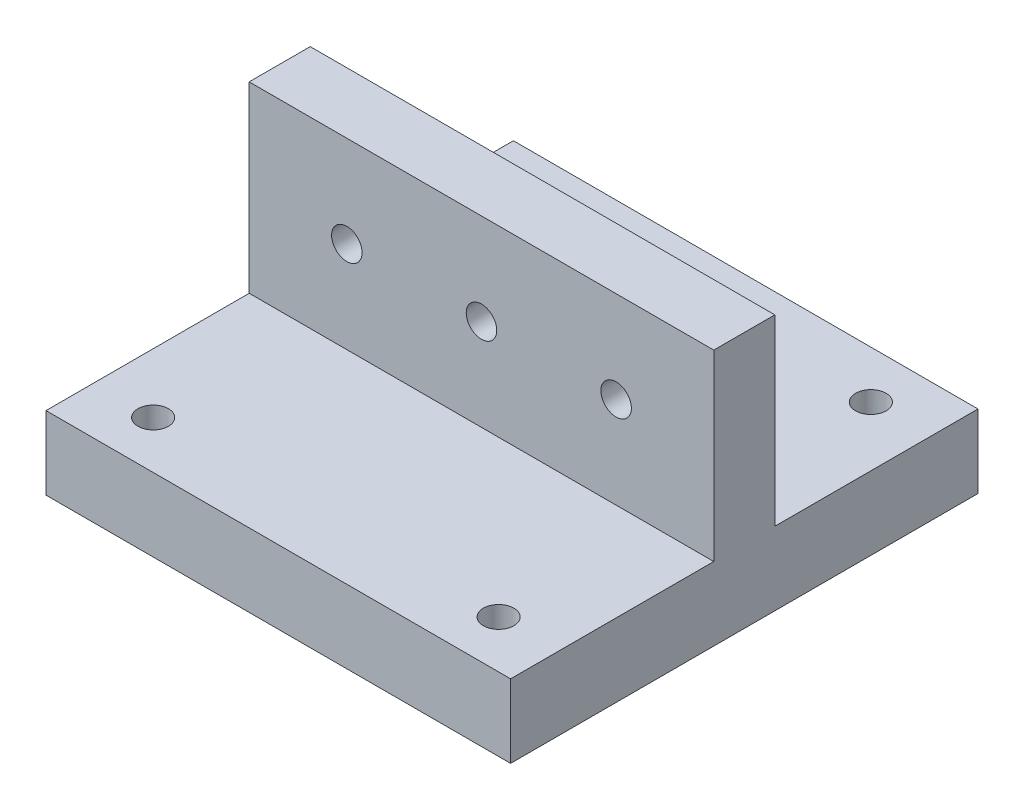
ISO-10303-21;
HEADER;
FILE_DESCRIPTION(('STEP AP214'),'2;1');
FILE_NAME('part.step','',(''),(''),'','','');
FILE_SCHEMA(('AUTOMOTIVE_DESIGN { 1 0 10303 214 1 1 1 1 }'));
ENDSEC;
DATA;
#1=APPLICATION_CONTEXT('core data for automotive mechanical design processes');
#2=APPLICATION_PROTOCOL_DEFINITION('international standard','automotive_design',2000,#1);
#3=PRODUCT_CONTEXT('',#1,'mechanical');
#4=PRODUCT('Part','Part','',(#3));
#5=PRODUCT_RELATED_PRODUCT_CATEGORY('part','',(#4));
#6=PRODUCT_DEFINITION_FORMATION('','',#4);
#7=PRODUCT_DEFINITION_CONTEXT('part definition',#1,'design');
#8=PRODUCT_DEFINITION('design','',#6,#7);
#9=PRODUCT_DEFINITION_SHAPE('','',#8);
#10=(LENGTH_UNIT() NAMED_UNIT(*) SI_UNIT(.MILLI.,.METRE.));
#11=(NAMED_UNIT(*) PLANE_ANGLE_UNIT() SI_UNIT($,.RADIAN.));
#12=(NAMED_UNIT(*) SI_UNIT($,.STERADIAN.) SOLID_ANGLE_UNIT());
#13=UNCERTAINTY_MEASURE_WITH_UNIT(LENGTH_MEASURE(1.E-05),#10,'distance_accuracy_value','');
#14=(GEOMETRIC_REPRESENTATION_CONTEXT(3) GLOBAL_UNCERTAINTY_ASSIGNED_CONTEXT((#13)) GLOBAL_UNIT_ASSIGNED_CONTEXT((#10,
#11,#12)) REPRESENTATION_CONTEXT('',''));
#15=CARTESIAN_POINT('',(0.,0.,0.));
#16=DIRECTION('',(0.,0.,1.));
#17=DIRECTION('',(1.,0.,0.));
#18=AXIS2_PLACEMENT_3D('',#15,#16,#17);
#19=CARTESIAN_POINT('',(0.,21.,0.));
#20=DIRECTION('',(1.,0.,0.));
#21=DIRECTION('',(0.,0.,-1.));
#22=AXIS2_PLACEMENT_3D('',#19,#20,#21);
#23=PLANE('',#22);
#24=DIRECTION('',(0.,0.,1.));
#25=VECTOR('',#24,1.);
#26=CARTESIAN_POINT('',(0.,21.,0.));
#27=LINE('',#26,#25);
#28=CARTESIAN_POINT('',(0.,21.,-21.645000016));
#29=VERTEX_POINT('',#28);
#30=CARTESIAN_POINT('',(0.,21.,-16.645000016));
#31=VERTEX_POINT('',#30);
#32=EDGE_CURVE('E121',#29,#31,#27,.T.);
#33=ORIENTED_EDGE('',*,*,#32,.F.);
#34=DIRECTION('',(0.,1.,0.));
#35=VECTOR('',#34,1.);
#36=CARTESIAN_POINT('',(0.,27.0590059354838,-21.645000016));
#37=LINE('',#36,#35);
#38=CARTESIAN_POINT('',(0.,6.,-21.645000016));
#39=VERTEX_POINT('',#38);
#40=EDGE_CURVE('E39',#39,#29,#37,.T.);
#41=ORIENTED_EDGE('',*,*,#40,.F.);
#42=DIRECTION('',(0.,0.,1.));
#43=VECTOR('',#42,1.);
#44=CARTESIAN_POINT('',(0.,6.,-46.7968028387097));
#45=LINE('',#44,#43);
#46=CARTESIAN_POINT('',(0.,6.,-38.29));
#47=VERTEX_POINT('',#46);
#48=EDGE_CURVE('E86',#47,#39,#45,.T.);
#49=ORIENTED_EDGE('',*,*,#48,.F.);
#50=DIRECTION('',(0.,-1.,0.));
#51=VECTOR('',#50,1.);
#52=CARTESIAN_POINT('',(0.,21.,-38.29));
#53=LINE('',#52,#51);
#54=CARTESIAN_POINT('',(0.,0.,-38.29));
#55=VERTEX_POINT('',#54);
#56=EDGE_CURVE('E127',#47,#55,#53,.T.);
#57=ORIENTED_EDGE('',*,*,#56,.T.);
#58=DIRECTION('',(0.,0.,1.));
#59=VECTOR('',#58,1.);
#60=CARTESIAN_POINT('',(0.,0.,0.));
#61=LINE('',#60,#59);
#62=CARTESIAN_POINT('',(0.,0.,0.));
#63=VERTEX_POINT('',#62);
#64=EDGE_CURVE('E120',#55,#63,#61,.T.);
#65=ORIENTED_EDGE('',*,*,#64,.T.);
#66=DIRECTION('',(0.,-1.,0.));
#67=VECTOR('',#66,1.);
#68=CARTESIAN_POINT('',(0.,21.,0.));
#69=LINE('',#68,#67);
#70=CARTESIAN_POINT('',(0.,6.,0.));
#71=VERTEX_POINT('',#70);
#72=EDGE_CURVE('E141',#71,#63,#69,.T.);
#73=ORIENTED_EDGE('',*,*,#72,.F.);
#74=DIRECTION('',(0.,0.,1.));
#75=VECTOR('',#74,1.);
#76=CARTESIAN_POINT('',(0.,6.,13.6292637419355));
#77=LINE('',#76,#75);
#78=CARTESIAN_POINT('',(0.,6.,-16.645000016));
#79=VERTEX_POINT('',#78);
#80=EDGE_CURVE('E110',#79,#71,#77,.T.);
#81=ORIENTED_EDGE('',*,*,#80,.F.);
#82=DIRECTION('',(0.,-1.,0.));
#83=VECTOR('',#82,1.);
#84=CARTESIAN_POINT('',(0.,27.0590059354838,-16.645000016));
#85=LINE('',#84,#83);
#86=EDGE_CURVE('E113',#31,#79,#85,.T.);
#87=ORIENTED_EDGE('',*,*,#86,.F.);
#88=EDGE_LOOP('',(#33,#41,#49,#57,#65,#73,#81,#87));
#89=FACE_BOUND('',#88,.T.);
#90=ADVANCED_FACE('F17',(#89),#23,.F.);
#91=CARTESIAN_POINT('',(0.,21.,0.));
#92=DIRECTION('',(0.,0.,-1.));
#93=DIRECTION('',(-1.,0.,0.));
#94=AXIS2_PLACEMENT_3D('',#91,#92,#93);
#95=PLANE('',#94);
#96=DIRECTION('',(0.,-1.,0.));
#97=VECTOR('',#96,1.);
#98=CARTESIAN_POINT('',(38.06,21.,0.));
#99=LINE('',#98,#97);
#100=CARTESIAN_POINT('',(38.06,6.,0.));
#101=VERTEX_POINT('',#100);
#102=CARTESIAN_POINT('',(38.06,0.,0.));
#103=VERTEX_POINT('',#102);
#104=EDGE_CURVE('E139',#101,#103,#99,.T.);
#105=ORIENTED_EDGE('',*,*,#104,.F.);
#106=DIRECTION('',(-1.,0.,0.));
#107=VECTOR('',#106,1.);
#108=CARTESIAN_POINT('',(0.,6.,0.));
#109=LINE('',#108,#107);
#110=EDGE_CURVE('E87',#101,#71,#109,.T.);
#111=ORIENTED_EDGE('',*,*,#110,.T.);
#112=ORIENTED_EDGE('',*,*,#72,.T.);
#113=DIRECTION('',(1.,0.,0.));
#114=VECTOR('',#113,1.);
#115=CARTESIAN_POINT('',(0.,0.,0.));
#116=LINE('',#115,#114);
#117=EDGE_CURVE('E130',#63,#103,#116,.T.);
#118=ORIENTED_EDGE('',*,*,#117,.T.);
#119=EDGE_LOOP('',(#105,#111,#112,#118));
#120=FACE_BOUND('',#119,.T.);
#121=ADVANCED_FACE('F157',(#120),#95,.F.);
#122=CARTESIAN_POINT('',(38.06,21.,0.));
#123=DIRECTION('',(-1.,0.,0.));
#124=DIRECTION('',(0.,0.,1.));
#125=AXIS2_PLACEMENT_3D('',#122,#123,#124);
#126=PLANE('',#125);
#127=DIRECTION('',(0.,0.,1.));
#128=VECTOR('',#127,1.);
#129=CARTESIAN_POINT('',(38.06,6.,-46.7968028387097));
#130=LINE('',#129,#128);
#131=CARTESIAN_POINT('',(38.06,6.,-38.29));
#132=VERTEX_POINT('',#131);
#133=CARTESIAN_POINT('',(38.06,6.,-21.645000016));
#134=VERTEX_POINT('',#133);
#135=EDGE_CURVE('E84',#132,#134,#130,.T.);
#136=ORIENTED_EDGE('',*,*,#135,.T.);
#137=DIRECTION('',(0.,1.,0.));
#138=VECTOR('',#137,1.);
#139=CARTESIAN_POINT('',(38.06,27.0590059354838,-21.645000016));
#140=LINE('',#139,#138);
#141=CARTESIAN_POINT('',(38.06,21.,-21.645000016));
#142=VERTEX_POINT('',#141);
#143=EDGE_CURVE('E88',#134,#142,#140,.T.);
#144=ORIENTED_EDGE('',*,*,#143,.T.);
#145=DIRECTION('',(0.,0.,-1.));
#146=VECTOR('',#145,1.);
#147=CARTESIAN_POINT('',(38.06,21.,0.));
#148=LINE('',#147,#146);
#149=CARTESIAN_POINT('',(38.06,21.,-16.645000016));
#150=VERTEX_POINT('',#149);
#151=EDGE_CURVE('E124',#150,#142,#148,.T.);
#152=ORIENTED_EDGE('',*,*,#151,.F.);
#153=DIRECTION('',(0.,-1.,0.));
#154=VECTOR('',#153,1.);
#155=CARTESIAN_POINT('',(38.06,27.0590059354838,-16.645000016));
#156=LINE('',#155,#154);
#157=CARTESIAN_POINT('',(38.06,6.,-16.645000016));
#158=VERTEX_POINT('',#157);
#159=EDGE_CURVE('E31',#150,#158,#156,.T.);
#160=ORIENTED_EDGE('',*,*,#159,.T.);
#161=DIRECTION('',(0.,0.,1.));
#162=VECTOR('',#161,1.);
#163=CARTESIAN_POINT('',(38.06,6.,13.6292637419355));
#164=LINE('',#163,#162);
#165=EDGE_CURVE('E109',#158,#101,#164,.T.);
#166=ORIENTED_EDGE('',*,*,#165,.T.);
#167=ORIENTED_EDGE('',*,*,#104,.T.);
#168=DIRECTION('',(0.,0.,-1.));
#169=VECTOR('',#168,1.);
#170=CARTESIAN_POINT('',(38.06,0.,0.));
#171=LINE('',#170,#169);
#172=CARTESIAN_POINT('',(38.06,0.,-38.29));
#173=VERTEX_POINT('',#172);
#174=EDGE_CURVE('E133',#103,#173,#171,.T.);
#175=ORIENTED_EDGE('',*,*,#174,.T.);
#176=DIRECTION('',(0.,-1.,0.));
#177=VECTOR('',#176,1.);
#178=CARTESIAN_POINT('',(38.06,21.,-38.29));
#179=LINE('',#178,#177);
#180=EDGE_CURVE('E99',#132,#173,#179,.T.);
#181=ORIENTED_EDGE('',*,*,#180,.F.);
#182=EDGE_LOOP('',(#136,#144,#152,#160,#166,#167,#175,#181));
#183=FACE_BOUND('',#182,.T.);
#184=ADVANCED_FACE('F97',(#183),#126,.F.);
#185=CARTESIAN_POINT('',(0.,21.,-38.29));
#186=DIRECTION('',(0.,0.,1.));
#187=DIRECTION('',(1.,0.,0.));
#188=AXIS2_PLACEMENT_3D('',#185,#186,#187);
#189=PLANE('',#188);
#190=ORIENTED_EDGE('',*,*,#56,.F.);
#191=DIRECTION('',(1.,0.,0.));
#192=VECTOR('',#191,1.);
#193=CARTESIAN_POINT('',(0.,6.,-38.29));
#194=LINE('',#193,#192);
#195=EDGE_CURVE('E11',#47,#132,#194,.T.);
#196=ORIENTED_EDGE('',*,*,#195,.T.);
#197=ORIENTED_EDGE('',*,*,#180,.T.);
#198=DIRECTION('',(-1.,0.,0.));
#199=VECTOR('',#198,1.);
#200=CARTESIAN_POINT('',(0.,0.,-38.29));
#201=LINE('',#200,#199);
#202=EDGE_CURVE('E125',#173,#55,#201,.T.);
#203=ORIENTED_EDGE('',*,*,#202,.T.);
#204=EDGE_LOOP('',(#190,#196,#197,#203));
#205=FACE_BOUND('',#204,.T.);
#206=ADVANCED_FACE('F166',(#205),#189,.F.);
#207=CARTESIAN_POINT('',(0.,21.,0.));
#208=DIRECTION('',(0.,-1.,0.));
#209=DIRECTION('',(0.,0.,-1.));
#210=AXIS2_PLACEMENT_3D('',#207,#208,#209);
#211=PLANE('',#210);
#212=ORIENTED_EDGE('',*,*,#151,.T.);
#213=DIRECTION('',(-1.,0.,0.));
#214=VECTOR('',#213,1.);
#215=CARTESIAN_POINT('',(0.,21.,-21.645000016));
#216=LINE('',#215,#214);
#217=EDGE_CURVE('E24',#142,#29,#216,.T.);
#218=ORIENTED_EDGE('',*,*,#217,.T.);
#219=ORIENTED_EDGE('',*,*,#32,.T.);
#220=DIRECTION('',(1.,0.,0.));
#221=VECTOR('',#220,1.);
#222=CARTESIAN_POINT('',(0.,21.,-16.645000016));
#223=LINE('',#222,#221);
#224=EDGE_CURVE('E143',#31,#150,#223,.T.);
#225=ORIENTED_EDGE('',*,*,#224,.T.);
#226=EDGE_LOOP('',(#212,#218,#219,#225));
#227=FACE_BOUND('',#226,.T.);
#228=ADVANCED_FACE('F146',(#227),#211,.F.);
#229=CARTESIAN_POINT('',(0.,0.,0.));
#230=DIRECTION('',(0.,-1.,0.));
#231=DIRECTION('',(0.,0.,-1.));
#232=AXIS2_PLACEMENT_3D('',#229,#230,#231);
#233=PLANE('',#232);
#234=CARTESIAN_POINT('',(33.18,0.,-3.9));
#235=DIRECTION('',(0.,-1.,0.));
#236=DIRECTION('',(0.,0.,-1.));
#237=AXIS2_PLACEMENT_3D('',#234,#235,#236);
#238=CIRCLE('',#237,1.25);
#239=CARTESIAN_POINT('',(33.18,0.,-5.15));
#240=VERTEX_POINT('',#239);
#241=EDGE_CURVE('E359',#240,#240,#238,.T.);
#242=ORIENTED_EDGE('',*,*,#241,.F.);
#243=EDGE_LOOP('',(#242));
#244=FACE_BOUND('',#243,.T.);
#245=CARTESIAN_POINT('',(4.88,0.,-3.9));
#246=DIRECTION('',(0.,-1.,0.));
#247=DIRECTION('',(0.,0.,-1.));
#248=AXIS2_PLACEMENT_3D('',#245,#246,#247);
#249=CIRCLE('',#248,1.25);
#250=CARTESIAN_POINT('',(4.88,0.,-5.15));
#251=VERTEX_POINT('',#250);
#252=EDGE_CURVE('E365',#251,#251,#249,.T.);
#253=ORIENTED_EDGE('',*,*,#252,.F.);
#254=EDGE_LOOP('',(#253));
#255=FACE_BOUND('',#254,.T.);
#256=CARTESIAN_POINT('',(4.88,0.,-34.39));
#257=DIRECTION('',(0.,-1.,0.));
#258=DIRECTION('',(0.,0.,-1.));
#259=AXIS2_PLACEMENT_3D('',#256,#257,#258);
#260=CIRCLE('',#259,1.25);
#261=CARTESIAN_POINT('',(4.88,0.,-35.64));
#262=VERTEX_POINT('',#261);
#263=EDGE_CURVE('E371',#262,#262,#260,.T.);
#264=ORIENTED_EDGE('',*,*,#263,.F.);
#265=EDGE_LOOP('',(#264));
#266=FACE_BOUND('',#265,.T.);
#267=CARTESIAN_POINT('',(33.18,0.,-34.39));
#268=DIRECTION('',(0.,-1.,0.));
#269=DIRECTION('',(0.,0.,-1.));
#270=AXIS2_PLACEMENT_3D('',#267,#268,#269);
#271=CIRCLE('',#270,1.25);
#272=CARTESIAN_POINT('',(33.18,0.,-35.64));
#273=VERTEX_POINT('',#272);
#274=EDGE_CURVE('E103',#273,#273,#271,.T.);
#275=ORIENTED_EDGE('',*,*,#274,.F.);
#276=EDGE_LOOP('',(#275));
#277=FACE_BOUND('',#276,.T.);
#278=ORIENTED_EDGE('',*,*,#64,.F.);
#279=ORIENTED_EDGE('',*,*,#202,.F.);
#280=ORIENTED_EDGE('',*,*,#174,.F.);
#281=ORIENTED_EDGE('',*,*,#117,.F.);
#282=EDGE_LOOP('',(#278,#279,#280,#281));
#283=FACE_BOUND('',#282,.T.);
#284=ADVANCED_FACE('F163',(#244,#255,#266,#277,#283),#233,.T.);
#285=CARTESIAN_POINT('',(38.06,6.,13.6292637419355));
#286=DIRECTION('',(0.,-1.,0.));
#287=DIRECTION('',(0.,0.,-1.));
#288=AXIS2_PLACEMENT_3D('',#285,#286,#287);
#289=PLANE('',#288);
#290=CARTESIAN_POINT('',(33.18,6.,-3.9));
#291=DIRECTION('',(0.,1.,0.));
#292=DIRECTION('',(0.,0.,1.));
#293=AXIS2_PLACEMENT_3D('',#290,#291,#292);
#294=CIRCLE('',#293,1.25);
#295=CARTESIAN_POINT('',(33.18,6.,-2.65));
#296=VERTEX_POINT('',#295);
#297=EDGE_CURVE('E356',#296,#296,#294,.T.);
#298=ORIENTED_EDGE('',*,*,#297,.F.);
#299=EDGE_LOOP('',(#298));
#300=FACE_BOUND('',#299,.T.);
#301=CARTESIAN_POINT('',(4.88,6.,-3.9));
#302=DIRECTION('',(0.,1.,0.));
#303=DIRECTION('',(0.,0.,1.));
#304=AXIS2_PLACEMENT_3D('',#301,#302,#303);
#305=CIRCLE('',#304,1.25);
#306=CARTESIAN_POINT('',(4.88,6.,-2.65));
#307=VERTEX_POINT('',#306);
#308=EDGE_CURVE('E362',#307,#307,#305,.T.);
#309=ORIENTED_EDGE('',*,*,#308,.F.);
#310=EDGE_LOOP('',(#309));
#311=FACE_BOUND('',#310,.T.);
#312=ORIENTED_EDGE('',*,*,#165,.F.);
#313=DIRECTION('',(-1.,0.,0.));
#314=VECTOR('',#313,1.);
#315=CARTESIAN_POINT('',(38.06,6.,-16.645000016));
#316=LINE('',#315,#314);
#317=EDGE_CURVE('E106',#158,#79,#316,.T.);
#318=ORIENTED_EDGE('',*,*,#317,.T.);
#319=ORIENTED_EDGE('',*,*,#80,.T.);
#320=ORIENTED_EDGE('',*,*,#110,.F.);
#321=EDGE_LOOP('',(#312,#318,#319,#320));
#322=FACE_BOUND('',#321,.T.);
#323=ADVANCED_FACE('F154',(#300,#311,#322),#289,.F.);
#324=CARTESIAN_POINT('',(38.06,27.0590059354838,-16.645000016));
#325=DIRECTION('',(0.,0.,-1.));
#326=DIRECTION('',(0.,1.,0.));
#327=AXIS2_PLACEMENT_3D('',#324,#325,#326);
#328=PLANE('',#327);
#329=CARTESIAN_POINT('',(30.060000002,13.5,-16.645000016));
#330=DIRECTION('',(0.,0.,-1.));
#331=DIRECTION('',(0.,1.,0.));
#332=AXIS2_PLACEMENT_3D('',#329,#330,#331);
#333=CIRCLE('',#332,1.25);
#334=CARTESIAN_POINT('',(30.060000002,14.75,-16.645000016));
#335=VERTEX_POINT('',#334);
#336=EDGE_CURVE('E337',#335,#335,#333,.T.);
#337=ORIENTED_EDGE('',*,*,#336,.T.);
#338=EDGE_LOOP('',(#337));
#339=FACE_BOUND('',#338,.T.);
#340=CARTESIAN_POINT('',(19.030000002,13.5,-16.645000016));
#341=DIRECTION('',(0.,0.,-1.));
#342=DIRECTION('',(0.,1.,0.));
#343=AXIS2_PLACEMENT_3D('',#340,#341,#342);
#344=CIRCLE('',#343,1.25);
#345=CARTESIAN_POINT('',(19.030000002,14.75,-16.645000016));
#346=VERTEX_POINT('',#345);
#347=EDGE_CURVE('E347',#346,#346,#344,.T.);
#348=ORIENTED_EDGE('',*,*,#347,.T.);
#349=EDGE_LOOP('',(#348));
#350=FACE_BOUND('',#349,.T.);
#351=CARTESIAN_POINT('',(8.000000002,13.5,-16.645000016));
#352=DIRECTION('',(0.,0.,-1.));
#353=DIRECTION('',(0.,1.,0.));
#354=AXIS2_PLACEMENT_3D('',#351,#352,#353);
#355=CIRCLE('',#354,1.25);
#356=CARTESIAN_POINT('',(8.000000002,14.75,-16.645000016));
#357=VERTEX_POINT('',#356);
#358=EDGE_CURVE('E353',#357,#357,#355,.T.);
#359=ORIENTED_EDGE('',*,*,#358,.T.);
#360=EDGE_LOOP('',(#359));
#361=FACE_BOUND('',#360,.T.);
#362=ORIENTED_EDGE('',*,*,#86,.T.);
#363=ORIENTED_EDGE('',*,*,#317,.F.);
#364=ORIENTED_EDGE('',*,*,#159,.F.);
#365=ORIENTED_EDGE('',*,*,#224,.F.);
#366=EDGE_LOOP('',(#362,#363,#364,#365));
#367=FACE_BOUND('',#366,.T.);
#368=ADVANCED_FACE('F151',(#339,#350,#361,#367),#328,.F.);
#369=CARTESIAN_POINT('',(38.06,6.,-46.7968028387097));
#370=DIRECTION('',(0.,-1.,0.));
#371=DIRECTION('',(0.,0.,-1.));
#372=AXIS2_PLACEMENT_3D('',#369,#370,#371);
#373=PLANE('',#372);
#374=CARTESIAN_POINT('',(4.88,6.,-34.39));
#375=DIRECTION('',(0.,1.,0.));
#376=DIRECTION('',(0.,0.,1.));
#377=AXIS2_PLACEMENT_3D('',#374,#375,#376);
#378=CIRCLE('',#377,1.25);
#379=CARTESIAN_POINT('',(4.88,6.,-33.14));
#380=VERTEX_POINT('',#379);
#381=EDGE_CURVE('E368',#380,#380,#378,.T.);
#382=ORIENTED_EDGE('',*,*,#381,.F.);
#383=EDGE_LOOP('',(#382));
#384=FACE_BOUND('',#383,.T.);
#385=CARTESIAN_POINT('',(33.18,6.,-34.39));
#386=DIRECTION('',(0.,1.,0.));
#387=DIRECTION('',(0.,0.,1.));
#388=AXIS2_PLACEMENT_3D('',#385,#386,#387);
#389=CIRCLE('',#388,1.25);
#390=CARTESIAN_POINT('',(33.18,6.,-33.14));
#391=VERTEX_POINT('',#390);
#392=EDGE_CURVE('E373',#391,#391,#389,.T.);
#393=ORIENTED_EDGE('',*,*,#392,.F.);
#394=EDGE_LOOP('',(#393));
#395=FACE_BOUND('',#394,.T.);
#396=ORIENTED_EDGE('',*,*,#48,.T.);
#397=DIRECTION('',(-1.,0.,0.));
#398=VECTOR('',#397,1.);
#399=CARTESIAN_POINT('',(38.06,6.,-21.645000016));
#400=LINE('',#399,#398);
#401=EDGE_CURVE('E80',#134,#39,#400,.T.);
#402=ORIENTED_EDGE('',*,*,#401,.F.);
#403=ORIENTED_EDGE('',*,*,#135,.F.);
#404=ORIENTED_EDGE('',*,*,#195,.F.);
#405=EDGE_LOOP('',(#396,#402,#403,#404));
#406=FACE_BOUND('',#405,.T.);
#407=ADVANCED_FACE('F82',(#384,#395,#406),#373,.F.);
#408=CARTESIAN_POINT('',(38.06,27.0590059354838,-21.645000016));
#409=DIRECTION('',(0.,0.,1.));
#410=DIRECTION('',(0.,-1.,0.));
#411=AXIS2_PLACEMENT_3D('',#408,#409,#410);
#412=PLANE('',#411);
#413=CARTESIAN_POINT('',(30.060000002,13.5,-21.645000016));
#414=DIRECTION('',(0.,0.,-1.));
#415=DIRECTION('',(0.,1.,0.));
#416=AXIS2_PLACEMENT_3D('',#413,#414,#415);
#417=CIRCLE('',#416,1.25);
#418=CARTESIAN_POINT('',(30.060000002,14.75,-21.645000016));
#419=VERTEX_POINT('',#418);
#420=EDGE_CURVE('E340',#419,#419,#417,.T.);
#421=ORIENTED_EDGE('',*,*,#420,.F.);
#422=EDGE_LOOP('',(#421));
#423=FACE_BOUND('',#422,.T.);
#424=CARTESIAN_POINT('',(19.030000002,13.5,-21.645000016));
#425=DIRECTION('',(0.,0.,-1.));
#426=DIRECTION('',(0.,1.,0.));
#427=AXIS2_PLACEMENT_3D('',#424,#425,#426);
#428=CIRCLE('',#427,1.25);
#429=CARTESIAN_POINT('',(19.030000002,14.75,-21.645000016));
#430=VERTEX_POINT('',#429);
#431=EDGE_CURVE('E342',#430,#430,#428,.T.);
#432=ORIENTED_EDGE('',*,*,#431,.F.);
#433=EDGE_LOOP('',(#432));
#434=FACE_BOUND('',#433,.T.);
#435=CARTESIAN_POINT('',(8.000000002,13.5,-21.645000016));
#436=DIRECTION('',(0.,0.,-1.));
#437=DIRECTION('',(0.,1.,0.));
#438=AXIS2_PLACEMENT_3D('',#435,#436,#437);
#439=CIRCLE('',#438,1.25);
#440=CARTESIAN_POINT('',(8.000000002,14.75,-21.645000016));
#441=VERTEX_POINT('',#440);
#442=EDGE_CURVE('E350',#441,#441,#439,.T.);
#443=ORIENTED_EDGE('',*,*,#442,.F.);
#444=EDGE_LOOP('',(#443));
#445=FACE_BOUND('',#444,.T.);
#446=ORIENTED_EDGE('',*,*,#143,.F.);
#447=ORIENTED_EDGE('',*,*,#401,.T.);
#448=ORIENTED_EDGE('',*,*,#40,.T.);
#449=ORIENTED_EDGE('',*,*,#217,.F.);
#450=EDGE_LOOP('',(#446,#447,#448,#449));
#451=FACE_BOUND('',#450,.T.);
#452=ADVANCED_FACE('F91',(#423,#434,#445,#451),#412,.F.);
#453=CARTESIAN_POINT('',(33.18,6.,-34.39));
#454=DIRECTION('',(0.,1.,0.));
#455=DIRECTION('',(0.,0.,1.));
#456=AXIS2_PLACEMENT_3D('',#453,#454,#455);
#457=CYLINDRICAL_SURFACE('',#456,1.25);
#458=ORIENTED_EDGE('',*,*,#392,.T.);
#459=EDGE_LOOP('',(#458));
#460=FACE_BOUND('',#459,.T.);
#461=ORIENTED_EDGE('',*,*,#274,.T.);
#462=EDGE_LOOP('',(#461));
#463=FACE_BOUND('',#462,.T.);
#464=ADVANCED_FACE('F249',(#460,#463),#457,.F.);
#465=CARTESIAN_POINT('',(4.88,6.,-34.39));
#466=DIRECTION('',(0.,1.,0.));
#467=DIRECTION('',(0.,0.,1.));
#468=AXIS2_PLACEMENT_3D('',#465,#466,#467);
#469=CYLINDRICAL_SURFACE('',#468,1.25);
#470=ORIENTED_EDGE('',*,*,#381,.T.);
#471=EDGE_LOOP('',(#470));
#472=FACE_BOUND('',#471,.T.);
#473=ORIENTED_EDGE('',*,*,#263,.T.);
#474=EDGE_LOOP('',(#473));
#475=FACE_BOUND('',#474,.T.);
#476=ADVANCED_FACE('F259',(#472,#475),#469,.F.);
#477=CARTESIAN_POINT('',(4.88,6.,-3.9));
#478=DIRECTION('',(0.,1.,0.));
#479=DIRECTION('',(0.,0.,1.));
#480=AXIS2_PLACEMENT_3D('',#477,#478,#479);
#481=CYLINDRICAL_SURFACE('',#480,1.25);
#482=ORIENTED_EDGE('',*,*,#308,.T.);
#483=EDGE_LOOP('',(#482));
#484=FACE_BOUND('',#483,.T.);
#485=ORIENTED_EDGE('',*,*,#252,.T.);
#486=EDGE_LOOP('',(#485));
#487=FACE_BOUND('',#486,.T.);
#488=ADVANCED_FACE('F269',(#484,#487),#481,.F.);
#489=CARTESIAN_POINT('',(33.18,6.,-3.9));
#490=DIRECTION('',(0.,1.,0.));
#491=DIRECTION('',(0.,0.,1.));
#492=AXIS2_PLACEMENT_3D('',#489,#490,#491);
#493=CYLINDRICAL_SURFACE('',#492,1.25);
#494=ORIENTED_EDGE('',*,*,#297,.T.);
#495=EDGE_LOOP('',(#494));
#496=FACE_BOUND('',#495,.T.);
#497=ORIENTED_EDGE('',*,*,#241,.T.);
#498=EDGE_LOOP('',(#497));
#499=FACE_BOUND('',#498,.T.);
#500=ADVANCED_FACE('F279',(#496,#499),#493,.F.);
#501=CARTESIAN_POINT('',(8.000000002,13.5,-21.645000016));
#502=DIRECTION('',(0.,0.,-1.));
#503=DIRECTION('',(0.,1.,0.));
#504=AXIS2_PLACEMENT_3D('',#501,#502,#503);
#505=CYLINDRICAL_SURFACE('',#504,1.25);
#506=ORIENTED_EDGE('',*,*,#358,.F.);
#507=EDGE_LOOP('',(#506));
#508=FACE_BOUND('',#507,.T.);
#509=ORIENTED_EDGE('',*,*,#442,.T.);
#510=EDGE_LOOP('',(#509));
#511=FACE_BOUND('',#510,.T.);
#512=ADVANCED_FACE('F289',(#508,#511),#505,.F.);
#513=CARTESIAN_POINT('',(19.030000002,13.5,-21.645000016));
#514=DIRECTION('',(0.,0.,-1.));
#515=DIRECTION('',(0.,1.,0.));
#516=AXIS2_PLACEMENT_3D('',#513,#514,#515);
#517=CYLINDRICAL_SURFACE('',#516,1.25);
#518=ORIENTED_EDGE('',*,*,#347,.F.);
#519=EDGE_LOOP('',(#518));
#520=FACE_BOUND('',#519,.T.);
#521=ORIENTED_EDGE('',*,*,#431,.T.);
#522=EDGE_LOOP('',(#521));
#523=FACE_BOUND('',#522,.T.);
#524=ADVANCED_FACE('F299',(#520,#523),#517,.F.);
#525=CARTESIAN_POINT('',(30.060000002,13.5,-21.645000016));
#526=DIRECTION('',(0.,0.,-1.));
#527=DIRECTION('',(0.,1.,0.));
#528=AXIS2_PLACEMENT_3D('',#525,#526,#527);
#529=CYLINDRICAL_SURFACE('',#528,1.25);
#530=ORIENTED_EDGE('',*,*,#336,.F.);
#531=EDGE_LOOP('',(#530));
#532=FACE_BOUND('',#531,.T.);
#533=ORIENTED_EDGE('',*,*,#420,.T.);
#534=EDGE_LOOP('',(#533));
#535=FACE_BOUND('',#534,.T.);
#536=ADVANCED_FACE('F310',(#532,#535),#529,.F.);
#537=CLOSED_SHELL('',(#90,#121,#184,#206,#228,#284,#323,#368,#407,#452,#464,#476,#488,#500,#512,
#524,#536));
#538=MANIFOLD_SOLID_BREP('B1',#537);
#539=ADVANCED_BREP_SHAPE_REPRESENTATION('',(#18,#538),#14);
#540=SHAPE_DEFINITION_REPRESENTATION(#9,#539);
ENDSEC;
END-ISO-10303-21;
